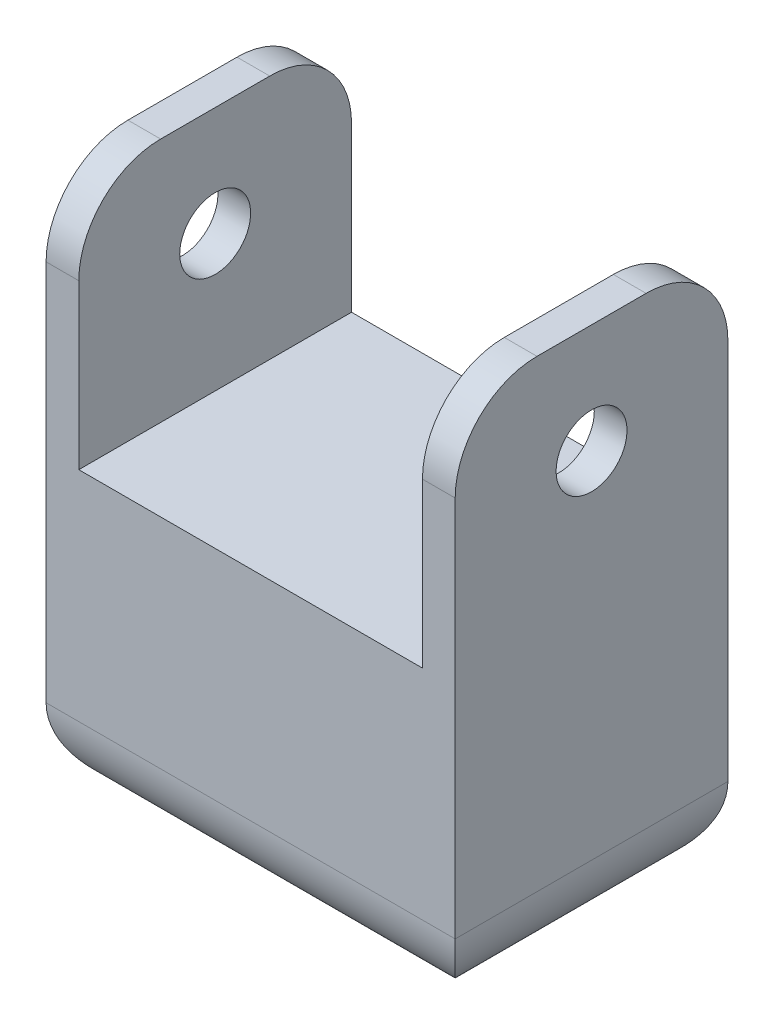
ISO-10303-21;
HEADER;
FILE_DESCRIPTION(('STEP AP214'),'2;1');
FILE_NAME('part.step','',(''),(''),'','','');
FILE_SCHEMA(('AUTOMOTIVE_DESIGN { 1 0 10303 214 1 1 1 1 }'));
ENDSEC;
DATA;
#1=APPLICATION_CONTEXT('core data for automotive mechanical design processes');
#2=APPLICATION_PROTOCOL_DEFINITION('international standard','automotive_design',2000,#1);
#3=PRODUCT_CONTEXT('',#1,'mechanical');
#4=PRODUCT('Part','Part','',(#3));
#5=PRODUCT_RELATED_PRODUCT_CATEGORY('part','',(#4));
#6=PRODUCT_DEFINITION_FORMATION('','',#4);
#7=PRODUCT_DEFINITION_CONTEXT('part definition',#1,'design');
#8=PRODUCT_DEFINITION('design','',#6,#7);
#9=PRODUCT_DEFINITION_SHAPE('','',#8);
#10=(LENGTH_UNIT() NAMED_UNIT(*) SI_UNIT(.MILLI.,.METRE.));
#11=(NAMED_UNIT(*) PLANE_ANGLE_UNIT() SI_UNIT($,.RADIAN.));
#12=(NAMED_UNIT(*) SI_UNIT($,.STERADIAN.) SOLID_ANGLE_UNIT());
#13=UNCERTAINTY_MEASURE_WITH_UNIT(LENGTH_MEASURE(1.E-05),#10,'distance_accuracy_value','');
#14=(GEOMETRIC_REPRESENTATION_CONTEXT(3) GLOBAL_UNCERTAINTY_ASSIGNED_CONTEXT((#13)) GLOBAL_UNIT_ASSIGNED_CONTEXT((#10,
#11,#12)) REPRESENTATION_CONTEXT('',''));
#15=CARTESIAN_POINT('',(0.,0.,0.));
#16=DIRECTION('',(0.,0.,1.));
#17=DIRECTION('',(1.,0.,0.));
#18=AXIS2_PLACEMENT_3D('',#15,#16,#17);
#19=CARTESIAN_POINT('',(0.,25.4,0.));
#20=DIRECTION('',(0.,1.,0.));
#21=DIRECTION('',(0.,0.,1.));
#22=AXIS2_PLACEMENT_3D('',#19,#20,#21);
#23=PLANE('',#22);
#24=DIRECTION('',(0.,0.,1.));
#25=VECTOR('',#24,1.);
#26=CARTESIAN_POINT('',(-19.05,25.4,-12.7));
#27=LINE('',#26,#25);
#28=CARTESIAN_POINT('',(-19.05,25.4,-5.08));
#29=VERTEX_POINT('',#28);
#30=CARTESIAN_POINT('',(-19.05,25.4,5.07999999999999));
#31=VERTEX_POINT('',#30);
#32=EDGE_CURVE('E187',#29,#31,#27,.T.);
#33=ORIENTED_EDGE('',*,*,#32,.T.);
#34=DIRECTION('',(1.,0.,0.));
#35=VECTOR('',#34,1.);
#36=CARTESIAN_POINT('',(-16.002,25.4,5.08));
#37=LINE('',#36,#35);
#38=CARTESIAN_POINT('',(-16.002,25.4,5.07999999999999));
#39=VERTEX_POINT('',#38);
#40=EDGE_CURVE('E227',#31,#39,#37,.T.);
#41=ORIENTED_EDGE('',*,*,#40,.T.);
#42=DIRECTION('',(0.,0.,1.));
#43=VECTOR('',#42,1.);
#44=CARTESIAN_POINT('',(-16.002,25.4,-12.7));
#45=LINE('',#44,#43);
#46=CARTESIAN_POINT('',(-16.002,25.4,-5.08));
#47=VERTEX_POINT('',#46);
#48=EDGE_CURVE('E173',#47,#39,#45,.T.);
#49=ORIENTED_EDGE('',*,*,#48,.F.);
#50=DIRECTION('',(-1.,0.,0.));
#51=VECTOR('',#50,1.);
#52=CARTESIAN_POINT('',(-19.05,25.4,-5.08));
#53=LINE('',#52,#51);
#54=EDGE_CURVE('E224',#47,#29,#53,.T.);
#55=ORIENTED_EDGE('',*,*,#54,.T.);
#56=EDGE_LOOP('',(#33,#41,#49,#55));
#57=FACE_BOUND('',#56,.T.);
#58=ADVANCED_FACE('F37',(#57),#23,.T.);
#59=CARTESIAN_POINT('',(19.05,25.4,-12.7));
#60=DIRECTION('',(-1.,0.,0.));
#61=DIRECTION('',(0.,0.,1.));
#62=AXIS2_PLACEMENT_3D('',#59,#60,#61);
#63=PLANE('',#62);
#64=CARTESIAN_POINT('',(19.05,15.24,0.));
#65=DIRECTION('',(-1.,0.,0.));
#66=DIRECTION('',(0.,0.,1.));
#67=AXIS2_PLACEMENT_3D('',#64,#65,#66);
#68=CIRCLE('',#67,3.302);
#69=CARTESIAN_POINT('',(19.05,15.24,3.30199999999999));
#70=VERTEX_POINT('',#69);
#71=EDGE_CURVE('E202',#70,#70,#68,.T.);
#72=ORIENTED_EDGE('',*,*,#71,.T.);
#73=EDGE_LOOP('',(#72));
#74=FACE_BOUND('',#73,.T.);
#75=DIRECTION('',(0.,-1.,0.));
#76=VECTOR('',#75,1.);
#77=CARTESIAN_POINT('',(19.05,25.4,12.7));
#78=LINE('',#77,#76);
#79=CARTESIAN_POINT('',(19.05,17.78,12.7));
#80=VERTEX_POINT('',#79);
#81=CARTESIAN_POINT('',(19.05,-17.78,12.7));
#82=VERTEX_POINT('',#81);
#83=EDGE_CURVE('E190',#80,#82,#78,.T.);
#84=ORIENTED_EDGE('',*,*,#83,.T.);
#85=DIRECTION('',(0.,0.,1.));
#86=VECTOR('',#85,1.);
#87=CARTESIAN_POINT('',(19.05,-17.78,-12.7));
#88=LINE('',#87,#86);
#89=CARTESIAN_POINT('',(19.05,-17.78,-12.7));
#90=VERTEX_POINT('',#89);
#91=EDGE_CURVE('E61',#82,#90,#88,.F.);
#92=ORIENTED_EDGE('',*,*,#91,.T.);
#93=DIRECTION('',(0.,-1.,0.));
#94=VECTOR('',#93,1.);
#95=CARTESIAN_POINT('',(19.05,25.4,-12.7));
#96=LINE('',#95,#94);
#97=CARTESIAN_POINT('',(19.05,17.78,-12.7));
#98=VERTEX_POINT('',#97);
#99=EDGE_CURVE('E196',#98,#90,#96,.T.);
#100=ORIENTED_EDGE('',*,*,#99,.F.);
#101=CARTESIAN_POINT('',(19.05,17.78,-5.08));
#102=DIRECTION('',(-1.,0.,0.));
#103=DIRECTION('',(0.,0.,1.));
#104=AXIS2_PLACEMENT_3D('',#101,#102,#103);
#105=CIRCLE('',#104,7.62);
#106=CARTESIAN_POINT('',(19.05,25.4,-5.08));
#107=VERTEX_POINT('',#106);
#108=EDGE_CURVE('E208',#98,#107,#105,.F.);
#109=ORIENTED_EDGE('',*,*,#108,.T.);
#110=DIRECTION('',(0.,0.,-1.));
#111=VECTOR('',#110,1.);
#112=CARTESIAN_POINT('',(19.05,25.4,-12.7));
#113=LINE('',#112,#111);
#114=CARTESIAN_POINT('',(19.05,25.4,5.07999999999999));
#115=VERTEX_POINT('',#114);
#116=EDGE_CURVE('E180',#115,#107,#113,.T.);
#117=ORIENTED_EDGE('',*,*,#116,.F.);
#118=CARTESIAN_POINT('',(19.05,17.78,5.08));
#119=DIRECTION('',(-1.,0.,0.));
#120=DIRECTION('',(0.,0.,1.));
#121=AXIS2_PLACEMENT_3D('',#118,#119,#120);
#122=CIRCLE('',#121,7.62);
#123=EDGE_CURVE('E210',#115,#80,#122,.F.);
#124=ORIENTED_EDGE('',*,*,#123,.T.);
#125=EDGE_LOOP('',(#84,#92,#100,#109,#117,#124));
#126=FACE_BOUND('',#125,.T.);
#127=ADVANCED_FACE('F291',(#74,#126),#63,.F.);
#128=CARTESIAN_POINT('',(-19.05,25.4,-12.7));
#129=DIRECTION('',(0.,0.,1.));
#130=DIRECTION('',(1.,0.,0.));
#131=AXIS2_PLACEMENT_3D('',#128,#129,#130);
#132=PLANE('',#131);
#133=ORIENTED_EDGE('',*,*,#99,.T.);
#134=DIRECTION('',(1.,0.,0.));
#135=VECTOR('',#134,1.);
#136=CARTESIAN_POINT('',(-19.05,-17.78,-12.7));
#137=LINE('',#136,#135);
#138=CARTESIAN_POINT('',(-19.05,-17.78,-12.7));
#139=VERTEX_POINT('',#138);
#140=EDGE_CURVE('E46',#90,#139,#137,.F.);
#141=ORIENTED_EDGE('',*,*,#140,.T.);
#142=DIRECTION('',(0.,-1.,0.));
#143=VECTOR('',#142,1.);
#144=CARTESIAN_POINT('',(-19.05,25.4,-12.7));
#145=LINE('',#144,#143);
#146=CARTESIAN_POINT('',(-19.05,17.78,-12.7));
#147=VERTEX_POINT('',#146);
#148=EDGE_CURVE('E194',#147,#139,#145,.T.);
#149=ORIENTED_EDGE('',*,*,#148,.F.);
#150=DIRECTION('',(-1.,0.,0.));
#151=VECTOR('',#150,1.);
#152=CARTESIAN_POINT('',(-16.002,17.78,-12.7));
#153=LINE('',#152,#151);
#154=CARTESIAN_POINT('',(-16.002,17.78,-12.7));
#155=VERTEX_POINT('',#154);
#156=EDGE_CURVE('E220',#147,#155,#153,.F.);
#157=ORIENTED_EDGE('',*,*,#156,.T.);
#158=DIRECTION('',(0.,1.,0.));
#159=VECTOR('',#158,1.);
#160=CARTESIAN_POINT('',(-16.002,2.54,-12.7));
#161=LINE('',#160,#159);
#162=CARTESIAN_POINT('',(-16.002,2.54,-12.7));
#163=VERTEX_POINT('',#162);
#164=EDGE_CURVE('E178',#163,#155,#161,.T.);
#165=ORIENTED_EDGE('',*,*,#164,.F.);
#166=DIRECTION('',(-1.,0.,0.));
#167=VECTOR('',#166,1.);
#168=CARTESIAN_POINT('',(-16.002,2.54,-12.7));
#169=LINE('',#168,#167);
#170=CARTESIAN_POINT('',(16.002,2.54,-12.7));
#171=VERTEX_POINT('',#170);
#172=EDGE_CURVE('E152',#171,#163,#169,.T.);
#173=ORIENTED_EDGE('',*,*,#172,.F.);
#174=DIRECTION('',(0.,1.,0.));
#175=VECTOR('',#174,1.);
#176=CARTESIAN_POINT('',(16.002,2.54,-12.7));
#177=LINE('',#176,#175);
#178=CARTESIAN_POINT('',(16.002,17.78,-12.7));
#179=VERTEX_POINT('',#178);
#180=EDGE_CURVE('E181',#171,#179,#177,.T.);
#181=ORIENTED_EDGE('',*,*,#180,.T.);
#182=DIRECTION('',(-1.,0.,0.));
#183=VECTOR('',#182,1.);
#184=CARTESIAN_POINT('',(19.05,17.78,-12.7));
#185=LINE('',#184,#183);
#186=EDGE_CURVE('E222',#179,#98,#185,.F.);
#187=ORIENTED_EDGE('',*,*,#186,.T.);
#188=EDGE_LOOP('',(#133,#141,#149,#157,#165,#173,#181,#187));
#189=FACE_BOUND('',#188,.T.);
#190=ADVANCED_FACE('F298',(#189),#132,.F.);
#191=CARTESIAN_POINT('',(-19.05,25.4,-12.7));
#192=DIRECTION('',(1.,0.,0.));
#193=DIRECTION('',(0.,0.,-1.));
#194=AXIS2_PLACEMENT_3D('',#191,#192,#193);
#195=PLANE('',#194);
#196=CARTESIAN_POINT('',(-19.05,15.24,0.));
#197=DIRECTION('',(-1.,0.,0.));
#198=DIRECTION('',(0.,0.,1.));
#199=AXIS2_PLACEMENT_3D('',#196,#197,#198);
#200=CIRCLE('',#199,3.302);
#201=CARTESIAN_POINT('',(-19.05,15.24,3.302));
#202=VERTEX_POINT('',#201);
#203=EDGE_CURVE('E261',#202,#202,#200,.T.);
#204=ORIENTED_EDGE('',*,*,#203,.F.);
#205=EDGE_LOOP('',(#204));
#206=FACE_BOUND('',#205,.T.);
#207=ORIENTED_EDGE('',*,*,#148,.T.);
#208=DIRECTION('',(0.,0.,-1.));
#209=VECTOR('',#208,1.);
#210=CARTESIAN_POINT('',(-19.05,-17.78,12.7));
#211=LINE('',#210,#209);
#212=CARTESIAN_POINT('',(-19.05,-17.78,12.7));
#213=VERTEX_POINT('',#212);
#214=EDGE_CURVE('E11',#139,#213,#211,.F.);
#215=ORIENTED_EDGE('',*,*,#214,.T.);
#216=DIRECTION('',(0.,-1.,0.));
#217=VECTOR('',#216,1.);
#218=CARTESIAN_POINT('',(-19.05,25.4,12.7));
#219=LINE('',#218,#217);
#220=CARTESIAN_POINT('',(-19.05,17.78,12.7));
#221=VERTEX_POINT('',#220);
#222=EDGE_CURVE('E192',#221,#213,#219,.T.);
#223=ORIENTED_EDGE('',*,*,#222,.F.);
#224=CARTESIAN_POINT('',(-19.05,17.78,5.08));
#225=DIRECTION('',(1.,0.,0.));
#226=DIRECTION('',(0.,0.,-1.));
#227=AXIS2_PLACEMENT_3D('',#224,#225,#226);
#228=CIRCLE('',#227,7.62);
#229=EDGE_CURVE('E235',#221,#31,#228,.F.);
#230=ORIENTED_EDGE('',*,*,#229,.T.);
#231=ORIENTED_EDGE('',*,*,#32,.F.);
#232=CARTESIAN_POINT('',(-19.05,17.78,-5.08));
#233=DIRECTION('',(1.,0.,0.));
#234=DIRECTION('',(0.,0.,-1.));
#235=AXIS2_PLACEMENT_3D('',#232,#233,#234);
#236=CIRCLE('',#235,7.62);
#237=EDGE_CURVE('E233',#29,#147,#236,.F.);
#238=ORIENTED_EDGE('',*,*,#237,.T.);
#239=EDGE_LOOP('',(#207,#215,#223,#230,#231,#238));
#240=FACE_BOUND('',#239,.T.);
#241=ADVANCED_FACE('F310',(#206,#240),#195,.F.);
#242=CARTESIAN_POINT('',(-19.05,25.4,12.7));
#243=DIRECTION('',(0.,0.,-1.));
#244=DIRECTION('',(-1.,0.,0.));
#245=AXIS2_PLACEMENT_3D('',#242,#243,#244);
#246=PLANE('',#245);
#247=ORIENTED_EDGE('',*,*,#222,.T.);
#248=DIRECTION('',(-1.,0.,0.));
#249=VECTOR('',#248,1.);
#250=CARTESIAN_POINT('',(19.05,-17.78,12.7));
#251=LINE('',#250,#249);
#252=EDGE_CURVE('E246',#213,#82,#251,.F.);
#253=ORIENTED_EDGE('',*,*,#252,.T.);
#254=ORIENTED_EDGE('',*,*,#83,.F.);
#255=DIRECTION('',(1.,0.,0.));
#256=VECTOR('',#255,1.);
#257=CARTESIAN_POINT('',(16.002,17.78,12.7));
#258=LINE('',#257,#256);
#259=CARTESIAN_POINT('',(16.002,17.78,12.7));
#260=VERTEX_POINT('',#259);
#261=EDGE_CURVE('E214',#80,#260,#258,.F.);
#262=ORIENTED_EDGE('',*,*,#261,.T.);
#263=DIRECTION('',(0.,1.,0.));
#264=VECTOR('',#263,1.);
#265=CARTESIAN_POINT('',(16.002,2.54,12.7));
#266=LINE('',#265,#264);
#267=CARTESIAN_POINT('',(16.002,2.54,12.7));
#268=VERTEX_POINT('',#267);
#269=EDGE_CURVE('E151',#268,#260,#266,.T.);
#270=ORIENTED_EDGE('',*,*,#269,.F.);
#271=DIRECTION('',(1.,0.,0.));
#272=VECTOR('',#271,1.);
#273=CARTESIAN_POINT('',(-16.002,2.54,12.7));
#274=LINE('',#273,#272);
#275=CARTESIAN_POINT('',(-16.002,2.54,12.7));
#276=VERTEX_POINT('',#275);
#277=EDGE_CURVE('E158',#276,#268,#274,.T.);
#278=ORIENTED_EDGE('',*,*,#277,.F.);
#279=DIRECTION('',(0.,1.,0.));
#280=VECTOR('',#279,1.);
#281=CARTESIAN_POINT('',(-16.002,2.54,12.7));
#282=LINE('',#281,#280);
#283=CARTESIAN_POINT('',(-16.002,17.78,12.7));
#284=VERTEX_POINT('',#283);
#285=EDGE_CURVE('E140',#276,#284,#282,.T.);
#286=ORIENTED_EDGE('',*,*,#285,.T.);
#287=DIRECTION('',(1.,0.,0.));
#288=VECTOR('',#287,1.);
#289=CARTESIAN_POINT('',(-19.05,17.78,12.7));
#290=LINE('',#289,#288);
#291=EDGE_CURVE('E212',#284,#221,#290,.F.);
#292=ORIENTED_EDGE('',*,*,#291,.T.);
#293=EDGE_LOOP('',(#247,#253,#254,#262,#270,#278,#286,#292));
#294=FACE_BOUND('',#293,.T.);
#295=ADVANCED_FACE('F165',(#294),#246,.F.);
#296=DIRECTION('',(0.,0.,-1.));
#297=VECTOR('',#296,1.);
#298=CARTESIAN_POINT('',(16.002,25.4,-12.7));
#299=LINE('',#298,#297);
#300=CARTESIAN_POINT('',(16.002,25.4,5.07999999999999));
#301=VERTEX_POINT('',#300);
#302=CARTESIAN_POINT('',(16.002,25.4,-5.08));
#303=VERTEX_POINT('',#302);
#304=EDGE_CURVE('E162',#301,#303,#299,.T.);
#305=ORIENTED_EDGE('',*,*,#304,.F.);
#306=DIRECTION('',(1.,0.,0.));
#307=VECTOR('',#306,1.);
#308=CARTESIAN_POINT('',(19.05,25.4,5.08));
#309=LINE('',#308,#307);
#310=EDGE_CURVE('E205',#301,#115,#309,.T.);
#311=ORIENTED_EDGE('',*,*,#310,.T.);
#312=ORIENTED_EDGE('',*,*,#116,.T.);
#313=DIRECTION('',(-1.,0.,0.));
#314=VECTOR('',#313,1.);
#315=CARTESIAN_POINT('',(16.002,25.4,-5.08));
#316=LINE('',#315,#314);
#317=EDGE_CURVE('E198',#107,#303,#316,.T.);
#318=ORIENTED_EDGE('',*,*,#317,.T.);
#319=EDGE_LOOP('',(#305,#311,#312,#318));
#320=FACE_BOUND('',#319,.T.);
#321=ADVANCED_FACE('F294',(#320),#23,.T.);
#322=CARTESIAN_POINT('',(-16.002,2.54,-12.7));
#323=DIRECTION('',(-1.,0.,0.));
#324=DIRECTION('',(0.,0.,1.));
#325=AXIS2_PLACEMENT_3D('',#322,#323,#324);
#326=PLANE('',#325);
#327=CARTESIAN_POINT('',(-16.002,15.24,0.));
#328=DIRECTION('',(-1.,0.,0.));
#329=DIRECTION('',(0.,0.,1.));
#330=AXIS2_PLACEMENT_3D('',#327,#328,#329);
#331=CIRCLE('',#330,3.302);
#332=CARTESIAN_POINT('',(-16.002,15.24,3.302));
#333=VERTEX_POINT('',#332);
#334=EDGE_CURVE('E175',#333,#333,#331,.T.);
#335=ORIENTED_EDGE('',*,*,#334,.T.);
#336=EDGE_LOOP('',(#335));
#337=FACE_BOUND('',#336,.T.);
#338=ORIENTED_EDGE('',*,*,#48,.T.);
#339=CARTESIAN_POINT('',(-16.002,17.78,5.08));
#340=DIRECTION('',(-1.,0.,0.));
#341=DIRECTION('',(0.,0.,1.));
#342=AXIS2_PLACEMENT_3D('',#339,#340,#341);
#343=CIRCLE('',#342,7.62);
#344=EDGE_CURVE('E147',#39,#284,#343,.F.);
#345=ORIENTED_EDGE('',*,*,#344,.T.);
#346=ORIENTED_EDGE('',*,*,#285,.F.);
#347=DIRECTION('',(0.,0.,1.));
#348=VECTOR('',#347,1.);
#349=CARTESIAN_POINT('',(-16.002,2.54,-12.7));
#350=LINE('',#349,#348);
#351=EDGE_CURVE('E145',#163,#276,#350,.T.);
#352=ORIENTED_EDGE('',*,*,#351,.F.);
#353=ORIENTED_EDGE('',*,*,#164,.T.);
#354=CARTESIAN_POINT('',(-16.002,17.78,-5.08));
#355=DIRECTION('',(-1.,0.,0.));
#356=DIRECTION('',(0.,0.,1.));
#357=AXIS2_PLACEMENT_3D('',#354,#355,#356);
#358=CIRCLE('',#357,7.62);
#359=EDGE_CURVE('E230',#155,#47,#358,.F.);
#360=ORIENTED_EDGE('',*,*,#359,.T.);
#361=EDGE_LOOP('',(#338,#345,#346,#352,#353,#360));
#362=FACE_BOUND('',#361,.T.);
#363=ADVANCED_FACE('F143',(#337,#362),#326,.F.);
#364=CARTESIAN_POINT('',(16.002,2.54,-12.7));
#365=DIRECTION('',(1.,0.,0.));
#366=DIRECTION('',(0.,0.,-1.));
#367=AXIS2_PLACEMENT_3D('',#364,#365,#366);
#368=PLANE('',#367);
#369=CARTESIAN_POINT('',(16.002,15.24,0.));
#370=DIRECTION('',(1.,0.,0.));
#371=DIRECTION('',(0.,0.,-1.));
#372=AXIS2_PLACEMENT_3D('',#369,#370,#371);
#373=CIRCLE('',#372,3.302);
#374=CARTESIAN_POINT('',(16.002,15.24,-3.302));
#375=VERTEX_POINT('',#374);
#376=EDGE_CURVE('E199',#375,#375,#373,.T.);
#377=ORIENTED_EDGE('',*,*,#376,.T.);
#378=EDGE_LOOP('',(#377));
#379=FACE_BOUND('',#378,.T.);
#380=ORIENTED_EDGE('',*,*,#269,.T.);
#381=CARTESIAN_POINT('',(16.002,17.78,5.08));
#382=DIRECTION('',(1.,0.,0.));
#383=DIRECTION('',(0.,0.,-1.));
#384=AXIS2_PLACEMENT_3D('',#381,#382,#383);
#385=CIRCLE('',#384,7.62);
#386=EDGE_CURVE('E218',#260,#301,#385,.F.);
#387=ORIENTED_EDGE('',*,*,#386,.T.);
#388=ORIENTED_EDGE('',*,*,#304,.T.);
#389=CARTESIAN_POINT('',(16.002,17.78,-5.08));
#390=DIRECTION('',(1.,0.,0.));
#391=DIRECTION('',(0.,0.,-1.));
#392=AXIS2_PLACEMENT_3D('',#389,#390,#391);
#393=CIRCLE('',#392,7.62);
#394=EDGE_CURVE('E216',#303,#179,#393,.F.);
#395=ORIENTED_EDGE('',*,*,#394,.T.);
#396=ORIENTED_EDGE('',*,*,#180,.F.);
#397=DIRECTION('',(0.,0.,-1.));
#398=VECTOR('',#397,1.);
#399=CARTESIAN_POINT('',(16.002,2.54,-12.7));
#400=LINE('',#399,#398);
#401=EDGE_CURVE('E167',#268,#171,#400,.T.);
#402=ORIENTED_EDGE('',*,*,#401,.F.);
#403=EDGE_LOOP('',(#380,#387,#388,#395,#396,#402));
#404=FACE_BOUND('',#403,.T.);
#405=ADVANCED_FACE('F309',(#379,#404),#368,.F.);
#406=CARTESIAN_POINT('',(0.,2.54,0.));
#407=DIRECTION('',(0.,1.,0.));
#408=DIRECTION('',(0.,0.,1.));
#409=AXIS2_PLACEMENT_3D('',#406,#407,#408);
#410=PLANE('',#409);
#411=ORIENTED_EDGE('',*,*,#351,.T.);
#412=ORIENTED_EDGE('',*,*,#277,.T.);
#413=ORIENTED_EDGE('',*,*,#401,.T.);
#414=ORIENTED_EDGE('',*,*,#172,.T.);
#415=EDGE_LOOP('',(#411,#412,#413,#414));
#416=FACE_BOUND('',#415,.T.);
#417=ADVANCED_FACE('F156',(#416),#410,.T.);
#418=CARTESIAN_POINT('',(19.05,15.24,0.));
#419=DIRECTION('',(-1.,0.,0.));
#420=DIRECTION('',(0.,0.,1.));
#421=AXIS2_PLACEMENT_3D('',#418,#419,#420);
#422=CYLINDRICAL_SURFACE('',#421,3.302);
#423=ORIENTED_EDGE('',*,*,#71,.F.);
#424=EDGE_LOOP('',(#423));
#425=FACE_BOUND('',#424,.T.);
#426=ORIENTED_EDGE('',*,*,#376,.F.);
#427=EDGE_LOOP('',(#426));
#428=FACE_BOUND('',#427,.T.);
#429=ADVANCED_FACE('F278',(#425,#428),#422,.F.);
#430=ORIENTED_EDGE('',*,*,#203,.T.);
#431=EDGE_LOOP('',(#430));
#432=FACE_BOUND('',#431,.T.);
#433=ORIENTED_EDGE('',*,*,#334,.F.);
#434=EDGE_LOOP('',(#433));
#435=FACE_BOUND('',#434,.T.);
#436=ADVANCED_FACE('F275',(#432,#435),#422,.F.);
#437=CARTESIAN_POINT('',(0.,17.78,5.08));
#438=DIRECTION('',(-1.,0.,0.));
#439=DIRECTION('',(0.,0.,1.));
#440=AXIS2_PLACEMENT_3D('',#437,#438,#439);
#441=CYLINDRICAL_SURFACE('',#440,7.62);
#442=ORIENTED_EDGE('',*,*,#386,.F.);
#443=ORIENTED_EDGE('',*,*,#261,.F.);
#444=ORIENTED_EDGE('',*,*,#123,.F.);
#445=ORIENTED_EDGE('',*,*,#310,.F.);
#446=EDGE_LOOP('',(#442,#443,#444,#445));
#447=FACE_BOUND('',#446,.T.);
#448=ADVANCED_FACE('F277',(#447),#441,.T.);
#449=CARTESIAN_POINT('',(0.,17.78,-5.08));
#450=DIRECTION('',(1.,0.,0.));
#451=DIRECTION('',(0.,0.,-1.));
#452=AXIS2_PLACEMENT_3D('',#449,#450,#451);
#453=CYLINDRICAL_SURFACE('',#452,7.62);
#454=ORIENTED_EDGE('',*,*,#108,.F.);
#455=ORIENTED_EDGE('',*,*,#186,.F.);
#456=ORIENTED_EDGE('',*,*,#394,.F.);
#457=ORIENTED_EDGE('',*,*,#317,.F.);
#458=EDGE_LOOP('',(#454,#455,#456,#457));
#459=FACE_BOUND('',#458,.T.);
#460=ADVANCED_FACE('F284',(#459),#453,.T.);
#461=CARTESIAN_POINT('',(0.,17.78,5.08));
#462=DIRECTION('',(-1.,0.,0.));
#463=DIRECTION('',(0.,0.,1.));
#464=AXIS2_PLACEMENT_3D('',#461,#462,#463);
#465=CYLINDRICAL_SURFACE('',#464,7.62);
#466=ORIENTED_EDGE('',*,*,#229,.F.);
#467=ORIENTED_EDGE('',*,*,#291,.F.);
#468=ORIENTED_EDGE('',*,*,#344,.F.);
#469=ORIENTED_EDGE('',*,*,#40,.F.);
#470=EDGE_LOOP('',(#466,#467,#468,#469));
#471=FACE_BOUND('',#470,.T.);
#472=ADVANCED_FACE('F344',(#471),#465,.T.);
#473=CARTESIAN_POINT('',(0.,17.78,-5.08));
#474=DIRECTION('',(1.,0.,0.));
#475=DIRECTION('',(0.,0.,-1.));
#476=AXIS2_PLACEMENT_3D('',#473,#474,#475);
#477=CYLINDRICAL_SURFACE('',#476,7.62);
#478=ORIENTED_EDGE('',*,*,#359,.F.);
#479=ORIENTED_EDGE('',*,*,#156,.F.);
#480=ORIENTED_EDGE('',*,*,#237,.F.);
#481=ORIENTED_EDGE('',*,*,#54,.F.);
#482=EDGE_LOOP('',(#478,#479,#480,#481));
#483=FACE_BOUND('',#482,.T.);
#484=ADVANCED_FACE('F341',(#483),#477,.T.);
#485=CARTESIAN_POINT('',(0.,-25.4,0.));
#486=DIRECTION('',(0.,-1.,0.));
#487=DIRECTION('',(0.,0.,-1.));
#488=AXIS2_PLACEMENT_3D('',#485,#486,#487);
#489=PLANE('',#488);
#490=DIRECTION('',(0.,0.,1.));
#491=VECTOR('',#490,1.);
#492=CARTESIAN_POINT('',(11.43,-25.4,12.7));
#493=LINE('',#492,#491);
#494=CARTESIAN_POINT('',(11.43,-25.4,-5.08));
#495=VERTEX_POINT('',#494);
#496=CARTESIAN_POINT('',(11.43,-25.4,5.08));
#497=VERTEX_POINT('',#496);
#498=EDGE_CURVE('E241',#495,#497,#493,.T.);
#499=ORIENTED_EDGE('',*,*,#498,.T.);
#500=DIRECTION('',(-1.,0.,0.));
#501=VECTOR('',#500,1.);
#502=CARTESIAN_POINT('',(-19.05,-25.4,5.08));
#503=LINE('',#502,#501);
#504=CARTESIAN_POINT('',(-11.43,-25.4,5.08));
#505=VERTEX_POINT('',#504);
#506=EDGE_CURVE('E243',#497,#505,#503,.T.);
#507=ORIENTED_EDGE('',*,*,#506,.T.);
#508=DIRECTION('',(0.,0.,-1.));
#509=VECTOR('',#508,1.);
#510=CARTESIAN_POINT('',(-11.43,-25.4,-12.7));
#511=LINE('',#510,#509);
#512=CARTESIAN_POINT('',(-11.43,-25.4,-5.08));
#513=VERTEX_POINT('',#512);
#514=EDGE_CURVE('E237',#505,#513,#511,.T.);
#515=ORIENTED_EDGE('',*,*,#514,.T.);
#516=DIRECTION('',(1.,0.,0.));
#517=VECTOR('',#516,1.);
#518=CARTESIAN_POINT('',(19.05,-25.4,-5.08));
#519=LINE('',#518,#517);
#520=EDGE_CURVE('E239',#513,#495,#519,.T.);
#521=ORIENTED_EDGE('',*,*,#520,.T.);
#522=EDGE_LOOP('',(#499,#507,#515,#521));
#523=FACE_BOUND('',#522,.T.);
#524=ADVANCED_FACE('F329',(#523),#489,.T.);
#525=CARTESIAN_POINT('',(0.,-17.78,-5.08));
#526=DIRECTION('',(-1.,0.,0.));
#527=DIRECTION('',(0.,0.,1.));
#528=AXIS2_PLACEMENT_3D('',#525,#526,#527);
#529=CYLINDRICAL_SURFACE('',#528,7.62);
#530=CARTESIAN_POINT('',(-11.43,-17.78,-5.08));
#531=DIRECTION('',(-0.707106781186547,0.,0.707106781186548));
#532=DIRECTION('',(0.707106781186548,0.,0.707106781186547));
#533=AXIS2_PLACEMENT_3D('',#530,#531,#532);
#534=ELLIPSE('',#533,10.776307345283,7.62);
#535=EDGE_CURVE('E254',#139,#513,#534,.T.);
#536=ORIENTED_EDGE('',*,*,#535,.F.);
#537=ORIENTED_EDGE('',*,*,#140,.F.);
#538=CARTESIAN_POINT('',(11.43,-17.78,-5.08));
#539=DIRECTION('',(-0.707106781186548,0.,-0.707106781186547));
#540=DIRECTION('',(-0.707106781186547,0.,0.707106781186548));
#541=AXIS2_PLACEMENT_3D('',#538,#539,#540);
#542=ELLIPSE('',#541,10.776307345283,7.62);
#543=EDGE_CURVE('E41',#495,#90,#542,.F.);
#544=ORIENTED_EDGE('',*,*,#543,.F.);
#545=ORIENTED_EDGE('',*,*,#520,.F.);
#546=EDGE_LOOP('',(#536,#537,#544,#545));
#547=FACE_BOUND('',#546,.T.);
#548=ADVANCED_FACE('F39',(#547),#529,.T.);
#549=CARTESIAN_POINT('',(11.43,-17.78,0.));
#550=DIRECTION('',(0.,0.,-1.));
#551=DIRECTION('',(-1.,0.,0.));
#552=AXIS2_PLACEMENT_3D('',#549,#550,#551);
#553=CYLINDRICAL_SURFACE('',#552,7.62);
#554=ORIENTED_EDGE('',*,*,#543,.T.);
#555=ORIENTED_EDGE('',*,*,#91,.F.);
#556=CARTESIAN_POINT('',(11.43,-17.78,5.08));
#557=DIRECTION('',(0.707106781186547,0.,-0.707106781186548));
#558=DIRECTION('',(-0.707106781186548,0.,-0.707106781186547));
#559=AXIS2_PLACEMENT_3D('',#556,#557,#558);
#560=ELLIPSE('',#559,10.776307345283,7.62);
#561=EDGE_CURVE('E253',#497,#82,#560,.F.);
#562=ORIENTED_EDGE('',*,*,#561,.F.);
#563=ORIENTED_EDGE('',*,*,#498,.F.);
#564=EDGE_LOOP('',(#554,#555,#562,#563));
#565=FACE_BOUND('',#564,.T.);
#566=ADVANCED_FACE('F330',(#565),#553,.T.);
#567=CARTESIAN_POINT('',(-11.43,-17.78,0.));
#568=DIRECTION('',(0.,0.,1.));
#569=DIRECTION('',(1.,0.,0.));
#570=AXIS2_PLACEMENT_3D('',#567,#568,#569);
#571=CYLINDRICAL_SURFACE('',#570,7.62);
#572=ORIENTED_EDGE('',*,*,#535,.T.);
#573=ORIENTED_EDGE('',*,*,#514,.F.);
#574=CARTESIAN_POINT('',(-11.43,-17.78,5.08));
#575=DIRECTION('',(0.707106781186548,0.,0.707106781186547));
#576=DIRECTION('',(-0.707106781186547,0.,0.707106781186548));
#577=AXIS2_PLACEMENT_3D('',#574,#575,#576);
#578=ELLIPSE('',#577,10.776307345283,7.62);
#579=EDGE_CURVE('E251',#213,#505,#578,.T.);
#580=ORIENTED_EDGE('',*,*,#579,.F.);
#581=ORIENTED_EDGE('',*,*,#214,.F.);
#582=EDGE_LOOP('',(#572,#573,#580,#581));
#583=FACE_BOUND('',#582,.T.);
#584=ADVANCED_FACE('F326',(#583),#571,.T.);
#585=CARTESIAN_POINT('',(0.,-17.78,5.08));
#586=DIRECTION('',(1.,0.,0.));
#587=DIRECTION('',(0.,0.,-1.));
#588=AXIS2_PLACEMENT_3D('',#585,#586,#587);
#589=CYLINDRICAL_SURFACE('',#588,7.62);
#590=ORIENTED_EDGE('',*,*,#561,.T.);
#591=ORIENTED_EDGE('',*,*,#252,.F.);
#592=ORIENTED_EDGE('',*,*,#579,.T.);
#593=ORIENTED_EDGE('',*,*,#506,.F.);
#594=EDGE_LOOP('',(#590,#591,#592,#593));
#595=FACE_BOUND('',#594,.T.);
#596=ADVANCED_FACE('F323',(#595),#589,.T.);
#597=CLOSED_SHELL('',(#58,#127,#190,#241,#295,#321,#363,#405,#417,#429,#436,#448,#460,#472,#484,
#524,#548,#566,#584,#596));
#598=MANIFOLD_SOLID_BREP('B2',#597);
#599=ADVANCED_BREP_SHAPE_REPRESENTATION('',(#18,#598),#14);
#600=SHAPE_DEFINITION_REPRESENTATION(#9,#599);
ENDSEC;
END-ISO-10303-21;
